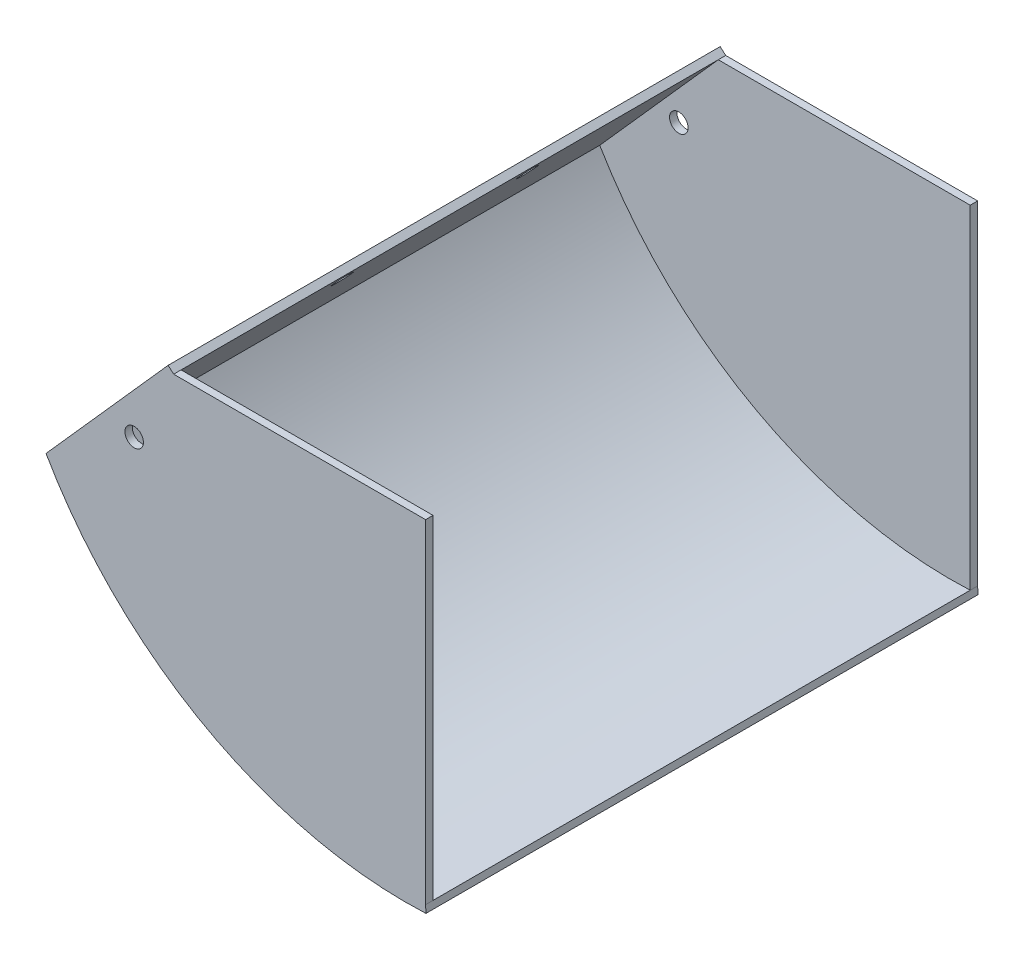
ISO-10303-21;
HEADER;
FILE_DESCRIPTION(('STEP AP214'),'2;1');
FILE_NAME('part.step','',(''),(''),'','','');
FILE_SCHEMA(('AUTOMOTIVE_DESIGN { 1 0 10303 214 1 1 1 1 }'));
ENDSEC;
DATA;
#1=APPLICATION_CONTEXT('core data for automotive mechanical design processes');
#2=APPLICATION_PROTOCOL_DEFINITION('international standard','automotive_design',2000,#1);
#3=PRODUCT_CONTEXT('',#1,'mechanical');
#4=PRODUCT('Part','Part','',(#3));
#5=PRODUCT_RELATED_PRODUCT_CATEGORY('part','',(#4));
#6=PRODUCT_DEFINITION_FORMATION('','',#4);
#7=PRODUCT_DEFINITION_CONTEXT('part definition',#1,'design');
#8=PRODUCT_DEFINITION('design','',#6,#7);
#9=PRODUCT_DEFINITION_SHAPE('','',#8);
#10=(LENGTH_UNIT() NAMED_UNIT(*) SI_UNIT(.MILLI.,.METRE.));
#11=(NAMED_UNIT(*) PLANE_ANGLE_UNIT() SI_UNIT($,.RADIAN.));
#12=(NAMED_UNIT(*) SI_UNIT($,.STERADIAN.) SOLID_ANGLE_UNIT());
#13=UNCERTAINTY_MEASURE_WITH_UNIT(LENGTH_MEASURE(1.E-05),#10,'distance_accuracy_value','');
#14=(GEOMETRIC_REPRESENTATION_CONTEXT(3) GLOBAL_UNCERTAINTY_ASSIGNED_CONTEXT((#13)) GLOBAL_UNIT_ASSIGNED_CONTEXT((#10,
#11,#12)) REPRESENTATION_CONTEXT('',''));
#15=CARTESIAN_POINT('',(0.,0.,0.));
#16=DIRECTION('',(0.,0.,1.));
#17=DIRECTION('',(1.,0.,0.));
#18=AXIS2_PLACEMENT_3D('',#15,#16,#17);
#19=CARTESIAN_POINT('',(-61.6593417472897,-35.0203309304048,-95.1));
#20=DIRECTION('',(0.,0.,-1.));
#21=DIRECTION('',(-1.,0.,0.));
#22=AXIS2_PLACEMENT_3D('',#19,#20,#21);
#23=CYLINDRICAL_SURFACE('',#22,2.5);
#24=CARTESIAN_POINT('',(-61.6593417472897,-35.0203309304048,-97.));
#25=DIRECTION('',(0.,0.,-1.));
#26=DIRECTION('',(-1.,0.,0.));
#27=AXIS2_PLACEMENT_3D('',#24,#25,#26);
#28=CIRCLE('',#27,2.5);
#29=CARTESIAN_POINT('',(-64.1593417472897,-35.0203309304048,-97.));
#30=VERTEX_POINT('',#29);
#31=EDGE_CURVE('E206',#30,#30,#28,.T.);
#32=CARTESIAN_POINT('',(-61.6593417472897,-35.0203309304048,-95.));
#33=DIRECTION('',(0.,0.,1.));
#34=DIRECTION('',(1.,0.,0.));
#35=AXIS2_PLACEMENT_3D('',#32,#33,#34);
#36=CIRCLE('',#35,2.5);
#37=CARTESIAN_POINT('',(-64.1593417472897,-35.0203309304048,-95.));
#38=VERTEX_POINT('',#37);
#39=EDGE_CURVE('E11',#38,#38,#36,.T.);
#40=CARTESIAN_POINT('',(-64.1593417472897,-35.0203309304048,-97.));
#41=CARTESIAN_POINT('',(-64.1593417472897,-35.0203309304048,-96.9791666666667));
#42=CARTESIAN_POINT('',(-64.1593417472897,-35.0203309304048,-96.9583333333333));
#43=CARTESIAN_POINT('',(-64.1593417472897,-35.0203309304048,-96.9166666666667));
#44=CARTESIAN_POINT('',(-64.1593417472897,-35.0203309304048,-96.8958333333333));
#45=CARTESIAN_POINT('',(-64.1593417472897,-35.0203309304048,-96.8541666666667));
#46=CARTESIAN_POINT('',(-64.1593417472897,-35.0203309304048,-96.8333333333333));
#47=CARTESIAN_POINT('',(-64.1593417472897,-35.0203309304048,-96.7916666666667));
#48=CARTESIAN_POINT('',(-64.1593417472897,-35.0203309304048,-96.7708333333333));
#49=CARTESIAN_POINT('',(-64.1593417472897,-35.0203309304048,-96.7291666666667));
#50=CARTESIAN_POINT('',(-64.1593417472897,-35.0203309304048,-96.7083333333333));
#51=CARTESIAN_POINT('',(-64.1593417472897,-35.0203309304048,-96.6666666666667));
#52=CARTESIAN_POINT('',(-64.1593417472897,-35.0203309304048,-96.6458333333333));
#53=CARTESIAN_POINT('',(-64.1593417472897,-35.0203309304048,-96.6041666666667));
#54=CARTESIAN_POINT('',(-64.1593417472897,-35.0203309304048,-96.5833333333333));
#55=CARTESIAN_POINT('',(-64.1593417472897,-35.0203309304048,-96.5416666666667));
#56=CARTESIAN_POINT('',(-64.1593417472897,-35.0203309304048,-96.5208333333333));
#57=CARTESIAN_POINT('',(-64.1593417472897,-35.0203309304048,-96.4791666666667));
#58=CARTESIAN_POINT('',(-64.1593417472897,-35.0203309304048,-96.4583333333333));
#59=CARTESIAN_POINT('',(-64.1593417472897,-35.0203309304048,-96.4166666666667));
#60=CARTESIAN_POINT('',(-64.1593417472897,-35.0203309304048,-96.3958333333333));
#61=CARTESIAN_POINT('',(-64.1593417472897,-35.0203309304048,-96.3541666666667));
#62=CARTESIAN_POINT('',(-64.1593417472897,-35.0203309304048,-96.3333333333333));
#63=CARTESIAN_POINT('',(-64.1593417472897,-35.0203309304048,-96.2916666666667));
#64=CARTESIAN_POINT('',(-64.1593417472897,-35.0203309304048,-96.2708333333333));
#65=CARTESIAN_POINT('',(-64.1593417472897,-35.0203309304048,-96.2291666666667));
#66=CARTESIAN_POINT('',(-64.1593417472897,-35.0203309304048,-96.2083333333333));
#67=CARTESIAN_POINT('',(-64.1593417472897,-35.0203309304048,-96.1666666666667));
#68=CARTESIAN_POINT('',(-64.1593417472897,-35.0203309304048,-96.1458333333333));
#69=CARTESIAN_POINT('',(-64.1593417472897,-35.0203309304048,-96.1041666666667));
#70=CARTESIAN_POINT('',(-64.1593417472897,-35.0203309304048,-96.0833333333333));
#71=CARTESIAN_POINT('',(-64.1593417472897,-35.0203309304048,-96.0416666666667));
#72=CARTESIAN_POINT('',(-64.1593417472897,-35.0203309304048,-96.0208333333333));
#73=CARTESIAN_POINT('',(-64.1593417472897,-35.0203309304048,-95.9791666666667));
#74=CARTESIAN_POINT('',(-64.1593417472897,-35.0203309304048,-95.9583333333333));
#75=CARTESIAN_POINT('',(-64.1593417472897,-35.0203309304048,-95.9166666666667));
#76=CARTESIAN_POINT('',(-64.1593417472897,-35.0203309304048,-95.8958333333333));
#77=CARTESIAN_POINT('',(-64.1593417472897,-35.0203309304048,-95.8541666666667));
#78=CARTESIAN_POINT('',(-64.1593417472897,-35.0203309304048,-95.8333333333333));
#79=CARTESIAN_POINT('',(-64.1593417472897,-35.0203309304048,-95.7916666666667));
#80=CARTESIAN_POINT('',(-64.1593417472897,-35.0203309304048,-95.7708333333333));
#81=CARTESIAN_POINT('',(-64.1593417472897,-35.0203309304048,-95.7291666666667));
#82=CARTESIAN_POINT('',(-64.1593417472897,-35.0203309304048,-95.7083333333333));
#83=CARTESIAN_POINT('',(-64.1593417472897,-35.0203309304048,-95.6666666666667));
#84=CARTESIAN_POINT('',(-64.1593417472897,-35.0203309304048,-95.6458333333333));
#85=CARTESIAN_POINT('',(-64.1593417472897,-35.0203309304048,-95.6041666666667));
#86=CARTESIAN_POINT('',(-64.1593417472897,-35.0203309304048,-95.5833333333333));
#87=CARTESIAN_POINT('',(-64.1593417472897,-35.0203309304048,-95.5416666666667));
#88=CARTESIAN_POINT('',(-64.1593417472897,-35.0203309304048,-95.5208333333333));
#89=CARTESIAN_POINT('',(-64.1593417472897,-35.0203309304048,-95.4791666666667));
#90=CARTESIAN_POINT('',(-64.1593417472897,-35.0203309304048,-95.4583333333333));
#91=CARTESIAN_POINT('',(-64.1593417472897,-35.0203309304048,-95.4166666666667));
#92=CARTESIAN_POINT('',(-64.1593417472897,-35.0203309304048,-95.3958333333333));
#93=CARTESIAN_POINT('',(-64.1593417472897,-35.0203309304048,-95.3541666666667));
#94=CARTESIAN_POINT('',(-64.1593417472897,-35.0203309304048,-95.3333333333333));
#95=CARTESIAN_POINT('',(-64.1593417472897,-35.0203309304048,-95.2916666666667));
#96=CARTESIAN_POINT('',(-64.1593417472897,-35.0203309304048,-95.2708333333333));
#97=CARTESIAN_POINT('',(-64.1593417472897,-35.0203309304048,-95.2291666666667));
#98=CARTESIAN_POINT('',(-64.1593417472897,-35.0203309304048,-95.2083333333333));
#99=CARTESIAN_POINT('',(-64.1593417472897,-35.0203309304048,-95.1666666666667));
#100=CARTESIAN_POINT('',(-64.1593417472897,-35.0203309304048,-95.1458333333333));
#101=CARTESIAN_POINT('',(-64.1593417472897,-35.0203309304048,-95.1041666666667));
#102=CARTESIAN_POINT('',(-64.1593417472897,-35.0203309304048,-95.0833333333333));
#103=CARTESIAN_POINT('',(-64.1593417472897,-35.0203309304048,-95.0416666666667));
#104=CARTESIAN_POINT('',(-64.1593417472897,-35.0203309304048,-95.0208333333333));
#105=CARTESIAN_POINT('',(-64.1593417472897,-35.0203309304048,-95.));
#106=B_SPLINE_CURVE_WITH_KNOTS('',3,(#40,#41,#42,#43,#44,#45,#46,#47,#48,#49,#50,#51,#52,#53,
#54,#55,#56,#57,#58,#59,#60,#61,#62,#63,#64,#65,#66,#67,#68,#69,#70,#71,#72,#73,#74,#75,#76,#77,
#78,#79,#80,#81,#82,#83,#84,#85,#86,#87,#88,#89,#90,#91,#92,#93,#94,#95,#96,#97,#98,#99,#100,
#101,#102,#103,#104,#105),.UNSPECIFIED.,.F.,.F.,(4,2,2,2,2,2,2,2,2,2,2,2,2,2,2,2,2,2,2,2,2,2,2,
2,2,2,2,2,2,2,2,2,4),(0.,0.0624999999999931,0.124999999999986,0.187499999999993,
0.249999999999986,0.312499999999993,0.374999999999986,0.437499999999993,0.499999999999987,
0.562499999999994,0.624999999999987,0.687499999999994,0.749999999999987,0.812499999999994,
0.874999999999987,0.937499999999994,0.999999999999987,1.06249999999998,1.12499999999999,
1.18749999999998,1.24999999999999,1.31249999999998,1.37499999999999,1.43749999999998,
1.49999999999999,1.56249999999998,1.62499999999999,1.68749999999998,1.74999999999999,
1.81249999999998,1.87499999999999,1.93749999999998,1.99999999999997),.UNSPECIFIED.);
#107=EDGE_CURVE('BSEAM38',#30,#38,#106,.T.);
#108=ORIENTED_EDGE('',*,*,#31,.T.);
#109=ORIENTED_EDGE('',*,*,#39,.T.);
#110=ORIENTED_EDGE('',*,*,#107,.T.);
#111=ORIENTED_EDGE('',*,*,#107,.F.);
#112=EDGE_LOOP('',(#108,#110,#109,#111));
#113=FACE_BOUND('',#112,.T.);
#114=ADVANCED_FACE('F38',(#113),#23,.F.);
#115=CARTESIAN_POINT('',(-49.0069084835103,-24.7993666227413,2.5));
#116=DIRECTION('',(-0.747409318683659,0.66436383882992,0.));
#117=DIRECTION('',(-0.66436383882992,-0.747409318683659,0.));
#118=AXIS2_PLACEMENT_3D('',#115,#116,#117);
#119=CYLINDRICAL_SURFACE('',#118,2.5);
#120=CARTESIAN_POINT('',(-56.4810016703469,-18.1557282344421,2.5));
#121=DIRECTION('',(-0.747409318683659,0.66436383882992,0.));
#122=DIRECTION('',(-0.66436383882992,-0.747409318683659,0.));
#123=AXIS2_PLACEMENT_3D('',#120,#121,#122);
#124=CIRCLE('',#123,2.5);
#125=CARTESIAN_POINT('',(-58.1419112674217,-20.0242515311512,2.5));
#126=VERTEX_POINT('',#125);
#127=EDGE_CURVE('E324',#126,#126,#124,.T.);
#128=ORIENTED_EDGE('',*,*,#127,.T.);
#129=EDGE_LOOP('',(#128));
#130=FACE_BOUND('',#129,.T.);
#131=CARTESIAN_POINT('',(-54.9861830329795,-19.484455912102,2.5));
#132=DIRECTION('',(-0.747409318683659,0.66436383882992,0.));
#133=DIRECTION('',(-0.66436383882992,-0.747409318683659,0.));
#134=AXIS2_PLACEMENT_3D('',#131,#132,#133);
#135=CIRCLE('',#134,2.5);
#136=CARTESIAN_POINT('',(-56.6470926300543,-21.3529792088111,2.5));
#137=VERTEX_POINT('',#136);
#138=EDGE_CURVE('E285',#137,#137,#135,.T.);
#139=ORIENTED_EDGE('',*,*,#138,.F.);
#140=EDGE_LOOP('',(#139));
#141=FACE_BOUND('',#140,.T.);
#142=ADVANCED_FACE('F194',(#130,#141),#119,.F.);
#143=CARTESIAN_POINT('',(-49.0069084835103,-24.7993666227413,-47.5));
#144=DIRECTION('',(-0.747409318683659,0.66436383882992,0.));
#145=DIRECTION('',(-0.66436383882992,-0.747409318683659,0.));
#146=AXIS2_PLACEMENT_3D('',#143,#144,#145);
#147=CYLINDRICAL_SURFACE('',#146,2.5);
#148=CARTESIAN_POINT('',(-56.4810016703469,-18.1557282344421,-47.5));
#149=DIRECTION('',(-0.747409318683659,0.66436383882992,0.));
#150=DIRECTION('',(-0.66436383882992,-0.747409318683659,0.));
#151=AXIS2_PLACEMENT_3D('',#148,#149,#150);
#152=CIRCLE('',#151,2.5);
#153=CARTESIAN_POINT('',(-58.1419112674217,-20.0242515311512,-47.5));
#154=VERTEX_POINT('',#153);
#155=EDGE_CURVE('E280',#154,#154,#152,.T.);
#156=ORIENTED_EDGE('',*,*,#155,.T.);
#157=EDGE_LOOP('',(#156));
#158=FACE_BOUND('',#157,.T.);
#159=CARTESIAN_POINT('',(-54.9861830329795,-19.484455912102,-47.5));
#160=DIRECTION('',(-0.747409318683659,0.66436383882992,0.));
#161=DIRECTION('',(-0.66436383882992,-0.747409318683659,0.));
#162=AXIS2_PLACEMENT_3D('',#159,#160,#161);
#163=CIRCLE('',#162,2.5);
#164=CARTESIAN_POINT('',(-56.6470926300543,-21.3529792088111,-47.5));
#165=VERTEX_POINT('',#164);
#166=EDGE_CURVE('E283',#165,#165,#163,.T.);
#167=ORIENTED_EDGE('',*,*,#166,.F.);
#168=EDGE_LOOP('',(#167));
#169=FACE_BOUND('',#168,.T.);
#170=ADVANCED_FACE('F200',(#158,#169),#147,.F.);
#171=CARTESIAN_POINT('',(17.,-15.,52.));
#172=DIRECTION('',(-1.,0.,0.));
#173=DIRECTION('',(0.,0.,1.));
#174=AXIS2_PLACEMENT_3D('',#171,#172,#173);
#175=PLANE('',#174);
#176=DIRECTION('',(0.,1.,0.));
#177=VECTOR('',#176,1.);
#178=CARTESIAN_POINT('',(17.,-15.,50.));
#179=LINE('',#178,#177);
#180=CARTESIAN_POINT('',(16.9999999999999,-105.,50.));
#181=VERTEX_POINT('',#180);
#182=CARTESIAN_POINT('',(17.,-15.,50.));
#183=VERTEX_POINT('',#182);
#184=EDGE_CURVE('E71',#181,#183,#179,.T.);
#185=ORIENTED_EDGE('',*,*,#184,.T.);
#186=DIRECTION('',(0.,0.,-1.));
#187=VECTOR('',#186,1.);
#188=CARTESIAN_POINT('',(17.,-15.,52.));
#189=LINE('',#188,#187);
#190=CARTESIAN_POINT('',(17.,-15.,52.));
#191=VERTEX_POINT('',#190);
#192=EDGE_CURVE('E173',#191,#183,#189,.T.);
#193=ORIENTED_EDGE('',*,*,#192,.F.);
#194=DIRECTION('',(0.,1.,0.));
#195=VECTOR('',#194,1.);
#196=CARTESIAN_POINT('',(17.,-15.,52.));
#197=LINE('',#196,#195);
#198=CARTESIAN_POINT('',(17.,-105.,52.));
#199=VERTEX_POINT('',#198);
#200=EDGE_CURVE('E79',#199,#191,#197,.T.);
#201=ORIENTED_EDGE('',*,*,#200,.F.);
#202=DIRECTION('',(0.,0.,-1.));
#203=VECTOR('',#202,1.);
#204=CARTESIAN_POINT('',(17.,-105.,52.));
#205=LINE('',#204,#203);
#206=EDGE_CURVE('E174',#199,#181,#205,.T.);
#207=ORIENTED_EDGE('',*,*,#206,.T.);
#208=EDGE_LOOP('',(#185,#193,#201,#207));
#209=FACE_BOUND('',#208,.T.);
#210=ADVANCED_FACE('F40',(#209),#175,.F.);
#211=CARTESIAN_POINT('',(-52.4948186373673,-13.6712723223402,-235.746242743244));
#212=DIRECTION('',(-0.747409318683659,0.66436383882992,0.));
#213=DIRECTION('',(-0.66436383882992,-0.747409318683659,0.));
#214=AXIS2_PLACEMENT_3D('',#211,#212,#213);
#215=PLANE('',#214);
#216=ORIENTED_EDGE('',*,*,#155,.F.);
#217=EDGE_LOOP('',(#216));
#218=FACE_BOUND('',#217,.T.);
#219=ORIENTED_EDGE('',*,*,#127,.F.);
#220=EDGE_LOOP('',(#219));
#221=FACE_BOUND('',#220,.T.);
#222=DIRECTION('',(0.,0.,1.));
#223=VECTOR('',#222,1.);
#224=CARTESIAN_POINT('',(-52.4948186373673,-13.6712723223402,-235.746242743244));
#225=LINE('',#224,#223);
#226=CARTESIAN_POINT('',(-52.4948186373673,-13.6712723223402,-97.));
#227=VERTEX_POINT('',#226);
#228=CARTESIAN_POINT('',(-52.4948186373673,-13.6712723223402,52.));
#229=VERTEX_POINT('',#228);
#230=EDGE_CURVE('E300',#227,#229,#225,.T.);
#231=ORIENTED_EDGE('',*,*,#230,.F.);
#232=DIRECTION('',(-0.66436383882992,-0.747409318683659,0.));
#233=VECTOR('',#232,1.);
#234=CARTESIAN_POINT('',(-52.4948186373673,-13.6712723223402,-97.));
#235=LINE('',#234,#233);
#236=CARTESIAN_POINT('',(-85.4564064699669,-50.7530586340146,-97.));
#237=VERTEX_POINT('',#236);
#238=EDGE_CURVE('E307',#227,#237,#235,.T.);
#239=ORIENTED_EDGE('',*,*,#238,.T.);
#240=DIRECTION('',(0.,0.,1.));
#241=VECTOR('',#240,1.);
#242=CARTESIAN_POINT('',(-85.4564064699669,-50.7530586340146,-235.746242743244));
#243=LINE('',#242,#241);
#244=CARTESIAN_POINT('',(-85.4564064699669,-50.7530586340146,52.));
#245=VERTEX_POINT('',#244);
#246=EDGE_CURVE('E308',#237,#245,#243,.T.);
#247=ORIENTED_EDGE('',*,*,#246,.T.);
#248=DIRECTION('',(-0.66436383882992,-0.747409318683659,0.));
#249=VECTOR('',#248,1.);
#250=CARTESIAN_POINT('',(-52.4948186373673,-13.6712723223402,52.));
#251=LINE('',#250,#249);
#252=EDGE_CURVE('E292',#229,#245,#251,.T.);
#253=ORIENTED_EDGE('',*,*,#252,.F.);
#254=EDGE_LOOP('',(#231,#239,#247,#253));
#255=FACE_BOUND('',#254,.T.);
#256=ADVANCED_FACE('F259',(#218,#221,#255),#215,.T.);
#257=CARTESIAN_POINT('',(11.7523691350774,4.87475765755079,-235.746242743244));
#258=DIRECTION('',(0.,0.,1.));
#259=DIRECTION('',(1.,0.,0.));
#260=AXIS2_PLACEMENT_3D('',#257,#258,#259);
#261=CYLINDRICAL_SURFACE('',#260,112.);
#262=ORIENTED_EDGE('',*,*,#246,.F.);
#263=CARTESIAN_POINT('',(11.7523691350774,4.87475765755079,-97.));
#264=DIRECTION('',(0.,0.,-1.));
#265=DIRECTION('',(-1.,0.,0.));
#266=AXIS2_PLACEMENT_3D('',#263,#264,#265);
#267=CIRCLE('',#266,112.);
#268=CARTESIAN_POINT('',(17.0954114702712,-106.997722866501,-97.));
#269=VERTEX_POINT('',#268);
#270=EDGE_CURVE('E284',#237,#269,#267,.F.);
#271=ORIENTED_EDGE('',*,*,#270,.T.);
#272=DIRECTION('',(0.,0.,1.));
#273=VECTOR('',#272,1.);
#274=CARTESIAN_POINT('',(17.0954114702712,-106.997722866501,-235.746242743244));
#275=LINE('',#274,#273);
#276=CARTESIAN_POINT('',(17.0954114702712,-106.997722866501,52.));
#277=VERTEX_POINT('',#276);
#278=EDGE_CURVE('E131',#269,#277,#275,.T.);
#279=ORIENTED_EDGE('',*,*,#278,.T.);
#280=CARTESIAN_POINT('',(11.7523691350774,4.87475765755079,52.));
#281=DIRECTION('',(0.,0.,1.));
#282=DIRECTION('',(1.,0.,0.));
#283=AXIS2_PLACEMENT_3D('',#280,#281,#282);
#284=CIRCLE('',#283,112.);
#285=EDGE_CURVE('E295',#245,#277,#284,.T.);
#286=ORIENTED_EDGE('',*,*,#285,.F.);
#287=EDGE_LOOP('',(#262,#271,#279,#286));
#288=FACE_BOUND('',#287,.T.);
#289=ADVANCED_FACE('F256',(#288),#261,.T.);
#290=CARTESIAN_POINT('',(16.9999999999999,-105.,-235.746242743244));
#291=DIRECTION('',(-0.998861433250462,-0.0477057351356576,0.));
#292=DIRECTION('',(0.0477057351356576,-0.998861433250462,0.));
#293=AXIS2_PLACEMENT_3D('',#290,#291,#292);
#294=PLANE('',#293);
#295=DIRECTION('',(0.0477057351356576,-0.998861433250462,0.));
#296=VECTOR('',#295,1.);
#297=CARTESIAN_POINT('',(16.9999999999999,-105.,-97.));
#298=LINE('',#297,#296);
#299=CARTESIAN_POINT('',(16.9999999999999,-105.,-97.));
#300=VERTEX_POINT('',#299);
#301=EDGE_CURVE('E123',#300,#269,#298,.T.);
#302=ORIENTED_EDGE('',*,*,#301,.F.);
#303=DIRECTION('',(0.,0.,1.));
#304=VECTOR('',#303,1.);
#305=CARTESIAN_POINT('',(17.,-105.,-97.));
#306=LINE('',#305,#304);
#307=CARTESIAN_POINT('',(17.,-105.,-95.));
#308=VERTEX_POINT('',#307);
#309=EDGE_CURVE('E128',#300,#308,#306,.T.);
#310=ORIENTED_EDGE('',*,*,#309,.T.);
#311=DIRECTION('',(0.,0.,1.));
#312=VECTOR('',#311,1.);
#313=CARTESIAN_POINT('',(16.9999999999999,-105.,-235.746242743244));
#314=LINE('',#313,#312);
#315=EDGE_CURVE('E303',#308,#181,#314,.T.);
#316=ORIENTED_EDGE('',*,*,#315,.T.);
#317=ORIENTED_EDGE('',*,*,#206,.F.);
#318=DIRECTION('',(0.0477057351356576,-0.998861433250462,0.));
#319=VECTOR('',#318,1.);
#320=CARTESIAN_POINT('',(16.9999999999999,-105.,52.));
#321=LINE('',#320,#319);
#322=EDGE_CURVE('E301',#199,#277,#321,.T.);
#323=ORIENTED_EDGE('',*,*,#322,.T.);
#324=ORIENTED_EDGE('',*,*,#278,.F.);
#325=EDGE_LOOP('',(#302,#310,#316,#317,#323,#324));
#326=FACE_BOUND('',#325,.T.);
#327=ADVANCED_FACE('F125',(#326),#294,.F.);
#328=CARTESIAN_POINT('',(17.,-15.,-97.));
#329=DIRECTION('',(-1.,0.,0.));
#330=DIRECTION('',(0.,0.,-1.));
#331=AXIS2_PLACEMENT_3D('',#328,#329,#330);
#332=PLANE('',#331);
#333=DIRECTION('',(0.,1.,0.));
#334=VECTOR('',#333,1.);
#335=CARTESIAN_POINT('',(17.,-15.,-95.));
#336=LINE('',#335,#334);
#337=CARTESIAN_POINT('',(17.,-15.,-95.));
#338=VERTEX_POINT('',#337);
#339=EDGE_CURVE('E152',#308,#338,#336,.T.);
#340=ORIENTED_EDGE('',*,*,#339,.F.);
#341=ORIENTED_EDGE('',*,*,#309,.F.);
#342=DIRECTION('',(0.,1.,0.));
#343=VECTOR('',#342,1.);
#344=CARTESIAN_POINT('',(17.,-15.,-97.));
#345=LINE('',#344,#343);
#346=CARTESIAN_POINT('',(17.,-15.,-97.));
#347=VERTEX_POINT('',#346);
#348=EDGE_CURVE('E139',#300,#347,#345,.T.);
#349=ORIENTED_EDGE('',*,*,#348,.T.);
#350=DIRECTION('',(0.,0.,1.));
#351=VECTOR('',#350,1.);
#352=CARTESIAN_POINT('',(17.,-15.,-97.));
#353=LINE('',#352,#351);
#354=EDGE_CURVE('E155',#347,#338,#353,.T.);
#355=ORIENTED_EDGE('',*,*,#354,.T.);
#356=EDGE_LOOP('',(#340,#341,#349,#355));
#357=FACE_BOUND('',#356,.T.);
#358=ADVANCED_FACE('F150',(#357),#332,.F.);
#359=CARTESIAN_POINT('',(-51.,-15.,-97.));
#360=DIRECTION('',(0.,-1.,0.));
#361=DIRECTION('',(0.,0.,1.));
#362=AXIS2_PLACEMENT_3D('',#359,#360,#361);
#363=PLANE('',#362);
#364=DIRECTION('',(-1.,0.,0.));
#365=VECTOR('',#364,1.);
#366=CARTESIAN_POINT('',(-51.,-15.,-95.));
#367=LINE('',#366,#365);
#368=CARTESIAN_POINT('',(-51.,-15.,-95.));
#369=VERTEX_POINT('',#368);
#370=EDGE_CURVE('E147',#338,#369,#367,.T.);
#371=ORIENTED_EDGE('',*,*,#370,.F.);
#372=ORIENTED_EDGE('',*,*,#354,.F.);
#373=DIRECTION('',(-1.,0.,0.));
#374=VECTOR('',#373,1.);
#375=CARTESIAN_POINT('',(-51.,-15.,-97.));
#376=LINE('',#375,#374);
#377=CARTESIAN_POINT('',(-51.,-15.,-97.));
#378=VERTEX_POINT('',#377);
#379=EDGE_CURVE('E143',#347,#378,#376,.T.);
#380=ORIENTED_EDGE('',*,*,#379,.T.);
#381=DIRECTION('',(0.,0.,1.));
#382=VECTOR('',#381,1.);
#383=CARTESIAN_POINT('',(-51.,-15.,-97.));
#384=LINE('',#383,#382);
#385=EDGE_CURVE('E160',#378,#369,#384,.T.);
#386=ORIENTED_EDGE('',*,*,#385,.T.);
#387=EDGE_LOOP('',(#371,#372,#380,#386));
#388=FACE_BOUND('',#387,.T.);
#389=ADVANCED_FACE('F227',(#388),#363,.F.);
#390=CARTESIAN_POINT('',(-52.4948186373673,-13.6712723223402,-235.746242743244));
#391=DIRECTION('',(-0.66436383882992,-0.74740931868366,0.));
#392=DIRECTION('',(0.74740931868366,-0.66436383882992,0.));
#393=AXIS2_PLACEMENT_3D('',#390,#391,#392);
#394=PLANE('',#393);
#395=DIRECTION('',(0.74740931868366,-0.66436383882992,0.));
#396=VECTOR('',#395,1.);
#397=CARTESIAN_POINT('',(-52.4948186373673,-13.6712723223402,-97.));
#398=LINE('',#397,#396);
#399=EDGE_CURVE('E136',#227,#378,#398,.T.);
#400=ORIENTED_EDGE('',*,*,#399,.F.);
#401=ORIENTED_EDGE('',*,*,#230,.T.);
#402=DIRECTION('',(0.74740931868366,-0.66436383882992,0.));
#403=VECTOR('',#402,1.);
#404=CARTESIAN_POINT('',(-52.4948186373673,-13.6712723223402,52.));
#405=LINE('',#404,#403);
#406=CARTESIAN_POINT('',(-51.,-15.,52.));
#407=VERTEX_POINT('',#406);
#408=EDGE_CURVE('E296',#229,#407,#405,.T.);
#409=ORIENTED_EDGE('',*,*,#408,.T.);
#410=DIRECTION('',(0.,0.,-1.));
#411=VECTOR('',#410,1.);
#412=CARTESIAN_POINT('',(-51.,-15.,52.));
#413=LINE('',#412,#411);
#414=CARTESIAN_POINT('',(-51.,-15.,50.));
#415=VERTEX_POINT('',#414);
#416=EDGE_CURVE('E165',#407,#415,#413,.T.);
#417=ORIENTED_EDGE('',*,*,#416,.T.);
#418=DIRECTION('',(0.,0.,1.));
#419=VECTOR('',#418,1.);
#420=CARTESIAN_POINT('',(-51.,-15.,-235.746242743244));
#421=LINE('',#420,#419);
#422=EDGE_CURVE('E299',#369,#415,#421,.T.);
#423=ORIENTED_EDGE('',*,*,#422,.F.);
#424=ORIENTED_EDGE('',*,*,#385,.F.);
#425=EDGE_LOOP('',(#400,#401,#409,#417,#423,#424));
#426=FACE_BOUND('',#425,.T.);
#427=ADVANCED_FACE('F229',(#426),#394,.F.);
#428=CARTESIAN_POINT('',(11.7523691350774,4.87475765755079,-97.));
#429=DIRECTION('',(0.,0.,-1.));
#430=DIRECTION('',(1.,0.,0.));
#431=AXIS2_PLACEMENT_3D('',#428,#429,#430);
#432=PLANE('',#431);
#433=ORIENTED_EDGE('',*,*,#31,.F.);
#434=EDGE_LOOP('',(#433));
#435=FACE_BOUND('',#434,.T.);
#436=ORIENTED_EDGE('',*,*,#399,.T.);
#437=ORIENTED_EDGE('',*,*,#379,.F.);
#438=ORIENTED_EDGE('',*,*,#348,.F.);
#439=ORIENTED_EDGE('',*,*,#301,.T.);
#440=ORIENTED_EDGE('',*,*,#270,.F.);
#441=ORIENTED_EDGE('',*,*,#238,.F.);
#442=EDGE_LOOP('',(#436,#437,#438,#439,#440,#441));
#443=FACE_BOUND('',#442,.T.);
#444=ADVANCED_FACE('F141',(#435,#443),#432,.T.);
#445=CARTESIAN_POINT('',(-51.,-15.,52.));
#446=DIRECTION('',(0.,-1.,0.));
#447=DIRECTION('',(0.,0.,-1.));
#448=AXIS2_PLACEMENT_3D('',#445,#446,#447);
#449=PLANE('',#448);
#450=DIRECTION('',(-1.,0.,0.));
#451=VECTOR('',#450,1.);
#452=CARTESIAN_POINT('',(-51.,-15.,50.));
#453=LINE('',#452,#451);
#454=EDGE_CURVE('E76',#183,#415,#453,.T.);
#455=ORIENTED_EDGE('',*,*,#454,.T.);
#456=ORIENTED_EDGE('',*,*,#416,.F.);
#457=DIRECTION('',(-1.,0.,0.));
#458=VECTOR('',#457,1.);
#459=CARTESIAN_POINT('',(-51.,-15.,52.));
#460=LINE('',#459,#458);
#461=EDGE_CURVE('E56',#191,#407,#460,.T.);
#462=ORIENTED_EDGE('',*,*,#461,.F.);
#463=ORIENTED_EDGE('',*,*,#192,.T.);
#464=EDGE_LOOP('',(#455,#456,#462,#463));
#465=FACE_BOUND('',#464,.T.);
#466=ADVANCED_FACE('F244',(#465),#449,.F.);
#467=CARTESIAN_POINT('',(11.7523691350774,4.87475765755079,52.));
#468=DIRECTION('',(0.,0.,1.));
#469=DIRECTION('',(1.,0.,0.));
#470=AXIS2_PLACEMENT_3D('',#467,#468,#469);
#471=PLANE('',#470);
#472=CARTESIAN_POINT('',(-61.6593417472897,-35.0203309304048,52.));
#473=DIRECTION('',(0.,0.,1.));
#474=DIRECTION('',(1.,0.,0.));
#475=AXIS2_PLACEMENT_3D('',#472,#473,#474);
#476=CIRCLE('',#475,2.5);
#477=CARTESIAN_POINT('',(-59.1593417472897,-35.0203309304048,52.));
#478=VERTEX_POINT('',#477);
#479=EDGE_CURVE('E327',#478,#478,#476,.T.);
#480=ORIENTED_EDGE('',*,*,#479,.F.);
#481=EDGE_LOOP('',(#480));
#482=FACE_BOUND('',#481,.T.);
#483=ORIENTED_EDGE('',*,*,#461,.T.);
#484=ORIENTED_EDGE('',*,*,#408,.F.);
#485=ORIENTED_EDGE('',*,*,#252,.T.);
#486=ORIENTED_EDGE('',*,*,#285,.T.);
#487=ORIENTED_EDGE('',*,*,#322,.F.);
#488=ORIENTED_EDGE('',*,*,#200,.T.);
#489=EDGE_LOOP('',(#483,#484,#485,#486,#487,#488));
#490=FACE_BOUND('',#489,.T.);
#491=ADVANCED_FACE('F241',(#482,#490),#471,.T.);
#492=CARTESIAN_POINT('',(11.7523691350774,4.87475765755079,-235.746242743244));
#493=DIRECTION('',(0.,0.,1.));
#494=DIRECTION('',(1.,0.,0.));
#495=AXIS2_PLACEMENT_3D('',#492,#493,#494);
#496=CYLINDRICAL_SURFACE('',#495,110.);
#497=DIRECTION('',(0.,0.,1.));
#498=VECTOR('',#497,1.);
#499=CARTESIAN_POINT('',(-83.,-51.,-235.746242743244));
#500=LINE('',#499,#498);
#501=CARTESIAN_POINT('',(-83.,-51.,-95.));
#502=VERTEX_POINT('',#501);
#503=CARTESIAN_POINT('',(-83.,-51.,50.));
#504=VERTEX_POINT('',#503);
#505=EDGE_CURVE('E313',#502,#504,#500,.T.);
#506=ORIENTED_EDGE('',*,*,#505,.T.);
#507=CARTESIAN_POINT('',(11.7523691350774,4.87475765755079,50.));
#508=DIRECTION('',(0.,0.,1.));
#509=DIRECTION('',(1.,0.,0.));
#510=AXIS2_PLACEMENT_3D('',#507,#508,#509);
#511=CIRCLE('',#510,110.);
#512=EDGE_CURVE('E158',#504,#181,#511,.T.);
#513=ORIENTED_EDGE('',*,*,#512,.T.);
#514=ORIENTED_EDGE('',*,*,#315,.F.);
#515=CARTESIAN_POINT('',(11.7523691350774,4.87475765755079,-95.));
#516=DIRECTION('',(0.,0.,1.));
#517=DIRECTION('',(1.,0.,0.));
#518=AXIS2_PLACEMENT_3D('',#515,#516,#517);
#519=CIRCLE('',#518,110.);
#520=EDGE_CURVE('E215',#502,#308,#519,.T.);
#521=ORIENTED_EDGE('',*,*,#520,.F.);
#522=EDGE_LOOP('',(#506,#513,#514,#521));
#523=FACE_BOUND('',#522,.T.);
#524=ADVANCED_FACE('F243',(#523),#496,.F.);
#525=CARTESIAN_POINT('',(-51.,-15.,-235.746242743244));
#526=DIRECTION('',(-0.747409318683659,0.66436383882992,0.));
#527=DIRECTION('',(-0.66436383882992,-0.747409318683659,0.));
#528=AXIS2_PLACEMENT_3D('',#525,#526,#527);
#529=PLANE('',#528);
#530=ORIENTED_EDGE('',*,*,#166,.T.);
#531=EDGE_LOOP('',(#530));
#532=FACE_BOUND('',#531,.T.);
#533=ORIENTED_EDGE('',*,*,#138,.T.);
#534=EDGE_LOOP('',(#533));
#535=FACE_BOUND('',#534,.T.);
#536=ORIENTED_EDGE('',*,*,#422,.T.);
#537=DIRECTION('',(-0.66436383882992,-0.74740931868366,0.));
#538=VECTOR('',#537,1.);
#539=CARTESIAN_POINT('',(-51.,-15.,50.));
#540=LINE('',#539,#538);
#541=EDGE_CURVE('E154',#415,#504,#540,.T.);
#542=ORIENTED_EDGE('',*,*,#541,.T.);
#543=ORIENTED_EDGE('',*,*,#505,.F.);
#544=DIRECTION('',(-0.66436383882992,-0.74740931868366,0.));
#545=VECTOR('',#544,1.);
#546=CARTESIAN_POINT('',(-51.,-15.,-95.));
#547=LINE('',#546,#545);
#548=EDGE_CURVE('E135',#369,#502,#547,.T.);
#549=ORIENTED_EDGE('',*,*,#548,.F.);
#550=EDGE_LOOP('',(#536,#542,#543,#549));
#551=FACE_BOUND('',#550,.T.);
#552=ADVANCED_FACE('F211',(#532,#535,#551),#529,.F.);
#553=CARTESIAN_POINT('',(11.7523691350774,4.87475765755079,-95.));
#554=DIRECTION('',(0.,0.,-1.));
#555=DIRECTION('',(1.,0.,0.));
#556=AXIS2_PLACEMENT_3D('',#553,#554,#555);
#557=PLANE('',#556);
#558=ORIENTED_EDGE('',*,*,#39,.F.);
#559=EDGE_LOOP('',(#558));
#560=FACE_BOUND('',#559,.T.);
#561=ORIENTED_EDGE('',*,*,#548,.T.);
#562=ORIENTED_EDGE('',*,*,#520,.T.);
#563=ORIENTED_EDGE('',*,*,#339,.T.);
#564=ORIENTED_EDGE('',*,*,#370,.T.);
#565=EDGE_LOOP('',(#561,#562,#563,#564));
#566=FACE_BOUND('',#565,.T.);
#567=ADVANCED_FACE('F189',(#560,#566),#557,.F.);
#568=CARTESIAN_POINT('',(11.7523691350774,4.87475765755079,50.));
#569=DIRECTION('',(0.,0.,1.));
#570=DIRECTION('',(1.,0.,0.));
#571=AXIS2_PLACEMENT_3D('',#568,#569,#570);
#572=PLANE('',#571);
#573=CARTESIAN_POINT('',(-61.6593417472897,-35.0203309304048,50.));
#574=DIRECTION('',(0.,0.,1.));
#575=DIRECTION('',(1.,0.,0.));
#576=AXIS2_PLACEMENT_3D('',#573,#574,#575);
#577=CIRCLE('',#576,2.5);
#578=CARTESIAN_POINT('',(-59.1593417472897,-35.0203309304048,50.));
#579=VERTEX_POINT('',#578);
#580=EDGE_CURVE('E42',#579,#579,#577,.T.);
#581=ORIENTED_EDGE('',*,*,#580,.T.);
#582=EDGE_LOOP('',(#581));
#583=FACE_BOUND('',#582,.T.);
#584=ORIENTED_EDGE('',*,*,#541,.F.);
#585=ORIENTED_EDGE('',*,*,#454,.F.);
#586=ORIENTED_EDGE('',*,*,#184,.F.);
#587=ORIENTED_EDGE('',*,*,#512,.F.);
#588=EDGE_LOOP('',(#584,#585,#586,#587));
#589=FACE_BOUND('',#588,.T.);
#590=ADVANCED_FACE('F178',(#583,#589),#572,.F.);
#591=CARTESIAN_POINT('',(-61.6593417472897,-35.0203309304048,50.1));
#592=DIRECTION('',(0.,0.,1.));
#593=DIRECTION('',(1.,0.,0.));
#594=AXIS2_PLACEMENT_3D('',#591,#592,#593);
#595=CYLINDRICAL_SURFACE('',#594,2.5);
#596=CARTESIAN_POINT('',(-59.1593417472897,-35.0203309304048,52.));
#597=CARTESIAN_POINT('',(-59.1593417472897,-35.0203309304048,51.9791666666667));
#598=CARTESIAN_POINT('',(-59.1593417472897,-35.0203309304048,51.9583333333333));
#599=CARTESIAN_POINT('',(-59.1593417472897,-35.0203309304048,51.9166666666667));
#600=CARTESIAN_POINT('',(-59.1593417472897,-35.0203309304048,51.8958333333333));
#601=CARTESIAN_POINT('',(-59.1593417472897,-35.0203309304048,51.8541666666667));
#602=CARTESIAN_POINT('',(-59.1593417472897,-35.0203309304048,51.8333333333333));
#603=CARTESIAN_POINT('',(-59.1593417472897,-35.0203309304048,51.7916666666667));
#604=CARTESIAN_POINT('',(-59.1593417472897,-35.0203309304048,51.7708333333333));
#605=CARTESIAN_POINT('',(-59.1593417472897,-35.0203309304048,51.7291666666667));
#606=CARTESIAN_POINT('',(-59.1593417472897,-35.0203309304048,51.7083333333333));
#607=CARTESIAN_POINT('',(-59.1593417472897,-35.0203309304048,51.6666666666667));
#608=CARTESIAN_POINT('',(-59.1593417472897,-35.0203309304048,51.6458333333333));
#609=CARTESIAN_POINT('',(-59.1593417472897,-35.0203309304048,51.6041666666667));
#610=CARTESIAN_POINT('',(-59.1593417472897,-35.0203309304048,51.5833333333333));
#611=CARTESIAN_POINT('',(-59.1593417472897,-35.0203309304048,51.5416666666667));
#612=CARTESIAN_POINT('',(-59.1593417472897,-35.0203309304048,51.5208333333333));
#613=CARTESIAN_POINT('',(-59.1593417472897,-35.0203309304048,51.4791666666667));
#614=CARTESIAN_POINT('',(-59.1593417472897,-35.0203309304048,51.4583333333333));
#615=CARTESIAN_POINT('',(-59.1593417472897,-35.0203309304048,51.4166666666667));
#616=CARTESIAN_POINT('',(-59.1593417472897,-35.0203309304048,51.3958333333333));
#617=CARTESIAN_POINT('',(-59.1593417472897,-35.0203309304048,51.3541666666667));
#618=CARTESIAN_POINT('',(-59.1593417472897,-35.0203309304048,51.3333333333333));
#619=CARTESIAN_POINT('',(-59.1593417472897,-35.0203309304048,51.2916666666667));
#620=CARTESIAN_POINT('',(-59.1593417472897,-35.0203309304048,51.2708333333333));
#621=CARTESIAN_POINT('',(-59.1593417472897,-35.0203309304048,51.2291666666667));
#622=CARTESIAN_POINT('',(-59.1593417472897,-35.0203309304048,51.2083333333333));
#623=CARTESIAN_POINT('',(-59.1593417472897,-35.0203309304048,51.1666666666667));
#624=CARTESIAN_POINT('',(-59.1593417472897,-35.0203309304048,51.1458333333333));
#625=CARTESIAN_POINT('',(-59.1593417472897,-35.0203309304048,51.1041666666667));
#626=CARTESIAN_POINT('',(-59.1593417472897,-35.0203309304048,51.0833333333333));
#627=CARTESIAN_POINT('',(-59.1593417472897,-35.0203309304048,51.0416666666667));
#628=CARTESIAN_POINT('',(-59.1593417472897,-35.0203309304048,51.0208333333333));
#629=CARTESIAN_POINT('',(-59.1593417472897,-35.0203309304048,50.9791666666667));
#630=CARTESIAN_POINT('',(-59.1593417472897,-35.0203309304048,50.9583333333333));
#631=CARTESIAN_POINT('',(-59.1593417472897,-35.0203309304048,50.9166666666667));
#632=CARTESIAN_POINT('',(-59.1593417472897,-35.0203309304048,50.8958333333333));
#633=CARTESIAN_POINT('',(-59.1593417472897,-35.0203309304048,50.8541666666667));
#634=CARTESIAN_POINT('',(-59.1593417472897,-35.0203309304048,50.8333333333333));
#635=CARTESIAN_POINT('',(-59.1593417472897,-35.0203309304048,50.7916666666667));
#636=CARTESIAN_POINT('',(-59.1593417472897,-35.0203309304048,50.7708333333333));
#637=CARTESIAN_POINT('',(-59.1593417472897,-35.0203309304048,50.7291666666667));
#638=CARTESIAN_POINT('',(-59.1593417472897,-35.0203309304048,50.7083333333333));
#639=CARTESIAN_POINT('',(-59.1593417472897,-35.0203309304048,50.6666666666667));
#640=CARTESIAN_POINT('',(-59.1593417472897,-35.0203309304048,50.6458333333333));
#641=CARTESIAN_POINT('',(-59.1593417472897,-35.0203309304048,50.6041666666667));
#642=CARTESIAN_POINT('',(-59.1593417472897,-35.0203309304048,50.5833333333333));
#643=CARTESIAN_POINT('',(-59.1593417472897,-35.0203309304048,50.5416666666667));
#644=CARTESIAN_POINT('',(-59.1593417472897,-35.0203309304048,50.5208333333333));
#645=CARTESIAN_POINT('',(-59.1593417472897,-35.0203309304048,50.4791666666667));
#646=CARTESIAN_POINT('',(-59.1593417472897,-35.0203309304048,50.4583333333333));
#647=CARTESIAN_POINT('',(-59.1593417472897,-35.0203309304048,50.4166666666667));
#648=CARTESIAN_POINT('',(-59.1593417472897,-35.0203309304048,50.3958333333333));
#649=CARTESIAN_POINT('',(-59.1593417472897,-35.0203309304048,50.3541666666667));
#650=CARTESIAN_POINT('',(-59.1593417472897,-35.0203309304048,50.3333333333333));
#651=CARTESIAN_POINT('',(-59.1593417472897,-35.0203309304048,50.2916666666667));
#652=CARTESIAN_POINT('',(-59.1593417472897,-35.0203309304048,50.2708333333333));
#653=CARTESIAN_POINT('',(-59.1593417472897,-35.0203309304048,50.2291666666667));
#654=CARTESIAN_POINT('',(-59.1593417472897,-35.0203309304048,50.2083333333333));
#655=CARTESIAN_POINT('',(-59.1593417472897,-35.0203309304048,50.1666666666667));
#656=CARTESIAN_POINT('',(-59.1593417472897,-35.0203309304048,50.1458333333333));
#657=CARTESIAN_POINT('',(-59.1593417472897,-35.0203309304048,50.1041666666667));
#658=CARTESIAN_POINT('',(-59.1593417472897,-35.0203309304048,50.0833333333333));
#659=CARTESIAN_POINT('',(-59.1593417472897,-35.0203309304048,50.0416666666667));
#660=CARTESIAN_POINT('',(-59.1593417472897,-35.0203309304048,50.0208333333333));
#661=CARTESIAN_POINT('',(-59.1593417472897,-35.0203309304048,50.));
#662=B_SPLINE_CURVE_WITH_KNOTS('',3,(#596,#597,#598,#599,#600,#601,#602,#603,#604,#605,#606,
#607,#608,#609,#610,#611,#612,#613,#614,#615,#616,#617,#618,#619,#620,#621,#622,#623,#624,#625,
#626,#627,#628,#629,#630,#631,#632,#633,#634,#635,#636,#637,#638,#639,#640,#641,#642,#643,#644,
#645,#646,#647,#648,#649,#650,#651,#652,#653,#654,#655,#656,#657,#658,#659,#660,#661),
.UNSPECIFIED.,.F.,.F.,(4,2,2,2,2,2,2,2,2,2,2,2,2,2,2,2,2,2,2,2,2,2,2,2,2,2,2,2,2,2,2,2,4),(0.,
0.0625000000000001,0.125,0.1875,0.25,0.3125,0.375,0.4375,0.5,0.5625,0.625000000000001,
0.687500000000001,0.750000000000001,0.812500000000001,0.875000000000001,0.937500000000001,1.,
1.0625,1.125,1.1875,1.25,1.3125,1.375,1.4375,1.5,1.5625,1.625,1.6875,1.75,1.8125,1.875,
1.93749999999999,1.99999999999999),.UNSPECIFIED.);
#663=EDGE_CURVE('BSEAM181',#478,#579,#662,.T.);
#664=ORIENTED_EDGE('',*,*,#479,.T.);
#665=ORIENTED_EDGE('',*,*,#580,.F.);
#666=ORIENTED_EDGE('',*,*,#663,.T.);
#667=ORIENTED_EDGE('',*,*,#663,.F.);
#668=EDGE_LOOP('',(#664,#666,#665,#667));
#669=FACE_BOUND('',#668,.T.);
#670=ADVANCED_FACE('F181',(#669),#595,.F.);
#671=CLOSED_SHELL('',(#114,#142,#170,#210,#256,#289,#327,#358,#389,#427,#444,#466,#491,#524,
#552,#567,#590,#670));
#672=MANIFOLD_SOLID_BREP('B2',#671);
#673=ADVANCED_BREP_SHAPE_REPRESENTATION('',(#18,#672),#14);
#674=SHAPE_DEFINITION_REPRESENTATION(#9,#673);
ENDSEC;
END-ISO-10303-21;
